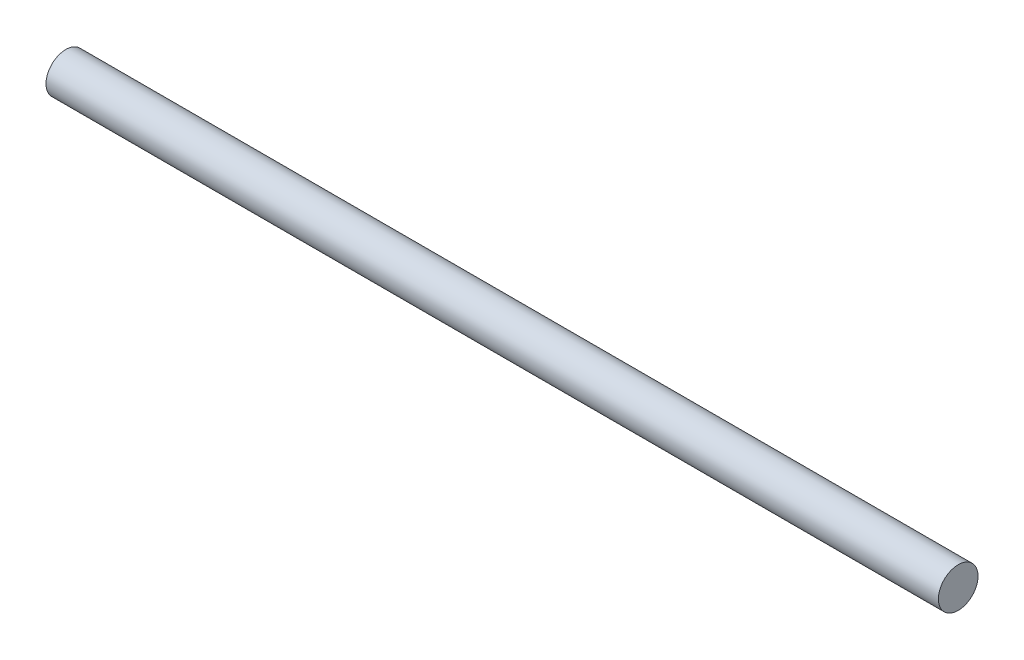
ISO-10303-21;
HEADER;
FILE_DESCRIPTION(('STEP AP214'),'2;1');
FILE_NAME('part.step','',(''),(''),'','','');
FILE_SCHEMA(('AUTOMOTIVE_DESIGN { 1 0 10303 214 1 1 1 1 }'));
ENDSEC;
DATA;
#1=APPLICATION_CONTEXT('core data for automotive mechanical design processes');
#2=APPLICATION_PROTOCOL_DEFINITION('international standard','automotive_design',2000,#1);
#3=PRODUCT_CONTEXT('',#1,'mechanical');
#4=PRODUCT('Part','Part','',(#3));
#5=PRODUCT_RELATED_PRODUCT_CATEGORY('part','',(#4));
#6=PRODUCT_DEFINITION_FORMATION('','',#4);
#7=PRODUCT_DEFINITION_CONTEXT('part definition',#1,'design');
#8=PRODUCT_DEFINITION('design','',#6,#7);
#9=PRODUCT_DEFINITION_SHAPE('','',#8);
#10=(LENGTH_UNIT() NAMED_UNIT(*) SI_UNIT(.MILLI.,.METRE.));
#11=(NAMED_UNIT(*) PLANE_ANGLE_UNIT() SI_UNIT($,.RADIAN.));
#12=(NAMED_UNIT(*) SI_UNIT($,.STERADIAN.) SOLID_ANGLE_UNIT());
#13=UNCERTAINTY_MEASURE_WITH_UNIT(LENGTH_MEASURE(1.E-05),#10,'distance_accuracy_value','');
#14=(GEOMETRIC_REPRESENTATION_CONTEXT(3) GLOBAL_UNCERTAINTY_ASSIGNED_CONTEXT((#13)) GLOBAL_UNIT_ASSIGNED_CONTEXT((#10,
#11,#12)) REPRESENTATION_CONTEXT('',''));
#15=CARTESIAN_POINT('',(0.,0.,0.));
#16=DIRECTION('',(0.,0.,1.));
#17=DIRECTION('',(1.,0.,0.));
#18=AXIS2_PLACEMENT_3D('',#15,#16,#17);
#19=CARTESIAN_POINT('',(45.,-75.,5.00000000000002));
#20=DIRECTION('',(-1.,0.,0.));
#21=DIRECTION('',(0.,0.,1.));
#22=AXIS2_PLACEMENT_3D('',#19,#20,#21);
#23=CYLINDRICAL_SURFACE('',#22,2.);
#24=CARTESIAN_POINT('',(45.,-75.,5.00000000000002));
#25=DIRECTION('',(-1.,0.,0.));
#26=DIRECTION('',(0.,0.,1.));
#27=AXIS2_PLACEMENT_3D('',#24,#25,#26);
#28=CIRCLE('',#27,2.);
#29=CARTESIAN_POINT('',(45.,-75.,7.00000000000002));
#30=VERTEX_POINT('',#29);
#31=EDGE_CURVE('E10',#30,#30,#28,.T.);
#32=ORIENTED_EDGE('',*,*,#31,.T.);
#33=EDGE_LOOP('',(#32));
#34=FACE_BOUND('',#33,.T.);
#35=CARTESIAN_POINT('',(-45.,-75.,5.00000000000002));
#36=DIRECTION('',(-1.,0.,0.));
#37=DIRECTION('',(0.,0.,1.));
#38=AXIS2_PLACEMENT_3D('',#35,#36,#37);
#39=CIRCLE('',#38,2.);
#40=CARTESIAN_POINT('',(-45.,-75.,7.00000000000002));
#41=VERTEX_POINT('',#40);
#42=EDGE_CURVE('E36',#41,#41,#39,.T.);
#43=ORIENTED_EDGE('',*,*,#42,.F.);
#44=EDGE_LOOP('',(#43));
#45=FACE_BOUND('',#44,.T.);
#46=ADVANCED_FACE('F30',(#34,#45),#23,.T.);
#47=CARTESIAN_POINT('',(45.,-73.,5.00000000000002));
#48=DIRECTION('',(1.,0.,0.));
#49=DIRECTION('',(0.,0.,-1.));
#50=AXIS2_PLACEMENT_3D('',#47,#48,#49);
#51=PLANE('',#50);
#52=ORIENTED_EDGE('',*,*,#31,.F.);
#53=EDGE_LOOP('',(#52));
#54=FACE_BOUND('',#53,.T.);
#55=ADVANCED_FACE('F45',(#54),#51,.T.);
#56=CARTESIAN_POINT('',(-45.,-75.,5.00000000000002));
#57=DIRECTION('',(-1.,0.,0.));
#58=DIRECTION('',(0.,0.,1.));
#59=AXIS2_PLACEMENT_3D('',#56,#57,#58);
#60=PLANE('',#59);
#61=ORIENTED_EDGE('',*,*,#42,.T.);
#62=EDGE_LOOP('',(#61));
#63=FACE_BOUND('',#62,.T.);
#64=ADVANCED_FACE('F42',(#63),#60,.T.);
#65=CLOSED_SHELL('',(#46,#55,#64));
#66=MANIFOLD_SOLID_BREP('B2',#65);
#67=ADVANCED_BREP_SHAPE_REPRESENTATION('',(#18,#66),#14);
#68=SHAPE_DEFINITION_REPRESENTATION(#9,#67);
ENDSEC;
END-ISO-10303-21;
